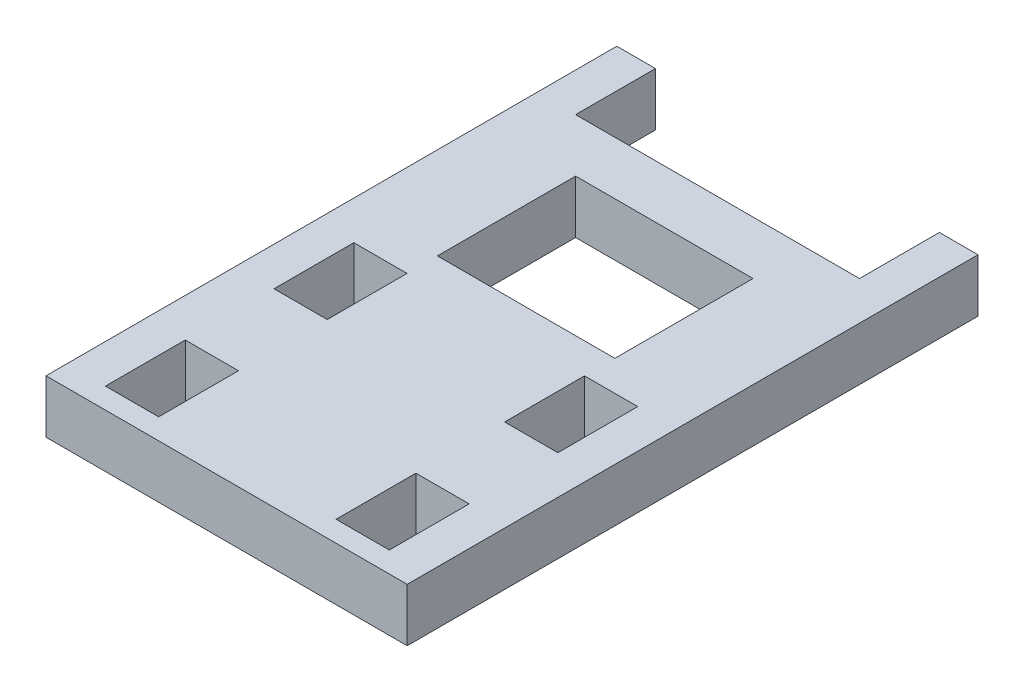
ISO-10303-21;
HEADER;
FILE_DESCRIPTION(('STEP AP214'),'2;1');
FILE_NAME('part.step','',(''),(''),'','','');
FILE_SCHEMA(('AUTOMOTIVE_DESIGN { 1 0 10303 214 1 1 1 1 }'));
ENDSEC;
DATA;
#1=APPLICATION_CONTEXT('core data for automotive mechanical design processes');
#2=APPLICATION_PROTOCOL_DEFINITION('international standard','automotive_design',2000,#1);
#3=PRODUCT_CONTEXT('',#1,'mechanical');
#4=PRODUCT('Part','Part','',(#3));
#5=PRODUCT_RELATED_PRODUCT_CATEGORY('part','',(#4));
#6=PRODUCT_DEFINITION_FORMATION('','',#4);
#7=PRODUCT_DEFINITION_CONTEXT('part definition',#1,'design');
#8=PRODUCT_DEFINITION('design','',#6,#7);
#9=PRODUCT_DEFINITION_SHAPE('','',#8);
#10=(LENGTH_UNIT() NAMED_UNIT(*) SI_UNIT(.MILLI.,.METRE.));
#11=(NAMED_UNIT(*) PLANE_ANGLE_UNIT() SI_UNIT($,.RADIAN.));
#12=(NAMED_UNIT(*) SI_UNIT($,.STERADIAN.) SOLID_ANGLE_UNIT());
#13=UNCERTAINTY_MEASURE_WITH_UNIT(LENGTH_MEASURE(1.E-05),#10,'distance_accuracy_value','');
#14=(GEOMETRIC_REPRESENTATION_CONTEXT(3) GLOBAL_UNCERTAINTY_ASSIGNED_CONTEXT((#13)) GLOBAL_UNIT_ASSIGNED_CONTEXT((#10,
#11,#12)) REPRESENTATION_CONTEXT('',''));
#15=CARTESIAN_POINT('',(0.,0.,0.));
#16=DIRECTION('',(0.,0.,1.));
#17=DIRECTION('',(1.,0.,0.));
#18=AXIS2_PLACEMENT_3D('',#15,#16,#17);
#19=CARTESIAN_POINT('',(0.,6.,0.));
#20=DIRECTION('',(0.,1.,0.));
#21=DIRECTION('',(0.,0.,1.));
#22=AXIS2_PLACEMENT_3D('',#19,#20,#21);
#23=PLANE('',#22);
#24=DIRECTION('',(1.,0.,0.));
#25=VECTOR('',#24,1.);
#26=CARTESIAN_POINT('',(-23.6219600534074,6.,14.5690045051622));
#27=LINE('',#26,#25);
#28=CARTESIAN_POINT('',(-23.6219600534074,6.,14.5690045051622));
#29=VERTEX_POINT('',#28);
#30=CARTESIAN_POINT('',(-17.6219600534074,6.,14.5690045051622));
#31=VERTEX_POINT('',#30);
#32=EDGE_CURVE('E265',#29,#31,#27,.T.);
#33=ORIENTED_EDGE('',*,*,#32,.F.);
#34=DIRECTION('',(0.,0.,1.));
#35=VECTOR('',#34,1.);
#36=CARTESIAN_POINT('',(-23.6219600534074,6.,5.56900450516224));
#37=LINE('',#36,#35);
#38=CARTESIAN_POINT('',(-23.6219600534074,6.,5.56900450516224));
#39=VERTEX_POINT('',#38);
#40=EDGE_CURVE('E263',#39,#29,#37,.T.);
#41=ORIENTED_EDGE('',*,*,#40,.F.);
#42=DIRECTION('',(-1.,0.,0.));
#43=VECTOR('',#42,1.);
#44=CARTESIAN_POINT('',(-23.6219600534074,6.,5.56900450516224));
#45=LINE('',#44,#43);
#46=CARTESIAN_POINT('',(-17.6219600534074,6.,5.56900450516224));
#47=VERTEX_POINT('',#46);
#48=EDGE_CURVE('E271',#47,#39,#45,.T.);
#49=ORIENTED_EDGE('',*,*,#48,.F.);
#50=DIRECTION('',(0.,0.,-1.));
#51=VECTOR('',#50,1.);
#52=CARTESIAN_POINT('',(-17.6219600534074,6.,5.56900450516224));
#53=LINE('',#52,#51);
#54=EDGE_CURVE('E268',#31,#47,#53,.T.);
#55=ORIENTED_EDGE('',*,*,#54,.F.);
#56=EDGE_LOOP('',(#33,#41,#49,#55));
#57=FACE_BOUND('',#56,.T.);
#58=DIRECTION('',(1.,0.,0.));
#59=VECTOR('',#58,1.);
#60=CARTESIAN_POINT('',(2.37803994659258,6.,14.5690045051622));
#61=LINE('',#60,#59);
#62=CARTESIAN_POINT('',(2.37803994659258,6.,14.5690045051622));
#63=VERTEX_POINT('',#62);
#64=CARTESIAN_POINT('',(8.37803994659258,6.,14.5690045051622));
#65=VERTEX_POINT('',#64);
#66=EDGE_CURVE('E327',#63,#65,#61,.T.);
#67=ORIENTED_EDGE('',*,*,#66,.F.);
#68=DIRECTION('',(0.,0.,1.));
#69=VECTOR('',#68,1.);
#70=CARTESIAN_POINT('',(2.37803994659258,6.,5.56900450516224));
#71=LINE('',#70,#69);
#72=CARTESIAN_POINT('',(2.37803994659258,6.,5.56900450516224));
#73=VERTEX_POINT('',#72);
#74=EDGE_CURVE('E325',#73,#63,#71,.T.);
#75=ORIENTED_EDGE('',*,*,#74,.F.);
#76=DIRECTION('',(-1.,0.,0.));
#77=VECTOR('',#76,1.);
#78=CARTESIAN_POINT('',(2.37803994659258,6.,5.56900450516224));
#79=LINE('',#78,#77);
#80=CARTESIAN_POINT('',(8.37803994659258,6.,5.56900450516224));
#81=VERTEX_POINT('',#80);
#82=EDGE_CURVE('E333',#81,#73,#79,.T.);
#83=ORIENTED_EDGE('',*,*,#82,.F.);
#84=DIRECTION('',(0.,0.,-1.));
#85=VECTOR('',#84,1.);
#86=CARTESIAN_POINT('',(8.37803994659258,6.,5.56900450516224));
#87=LINE('',#86,#85);
#88=EDGE_CURVE('E330',#65,#81,#87,.T.);
#89=ORIENTED_EDGE('',*,*,#88,.F.);
#90=EDGE_LOOP('',(#67,#75,#83,#89));
#91=FACE_BOUND('',#90,.T.);
#92=DIRECTION('',(0.,0.,-1.));
#93=VECTOR('',#92,1.);
#94=CARTESIAN_POINT('',(12.7338913134026,6.,-17.5799324330999));
#95=LINE('',#94,#93);
#96=CARTESIAN_POINT('',(12.7338913134026,6.,16.9099557832026));
#97=VERTEX_POINT('',#96);
#98=CARTESIAN_POINT('',(12.7338913134026,6.,-47.4309954948378));
#99=VERTEX_POINT('',#98);
#100=EDGE_CURVE('E387',#97,#99,#95,.T.);
#101=ORIENTED_EDGE('',*,*,#100,.T.);
#102=DIRECTION('',(-1.,0.,0.));
#103=VECTOR('',#102,1.);
#104=CARTESIAN_POINT('',(12.7338913134026,6.,-47.4309954948378));
#105=LINE('',#104,#103);
#106=CARTESIAN_POINT('',(8.37803994659257,6.,-47.4309954948378));
#107=VERTEX_POINT('',#106);
#108=EDGE_CURVE('E390',#99,#107,#105,.T.);
#109=ORIENTED_EDGE('',*,*,#108,.T.);
#110=DIRECTION('',(0.,0.,1.));
#111=VECTOR('',#110,1.);
#112=CARTESIAN_POINT('',(8.37803994659257,6.,-38.4309954948378));
#113=LINE('',#112,#111);
#114=CARTESIAN_POINT('',(8.37803994659257,6.,-38.4309954948378));
#115=VERTEX_POINT('',#114);
#116=EDGE_CURVE('E393',#107,#115,#113,.T.);
#117=ORIENTED_EDGE('',*,*,#116,.T.);
#118=DIRECTION('',(-1.,0.,0.));
#119=VECTOR('',#118,1.);
#120=CARTESIAN_POINT('',(-23.6219600534074,6.,-38.4309954948378));
#121=LINE('',#120,#119);
#122=CARTESIAN_POINT('',(-23.6219600534074,6.,-38.4309954948378));
#123=VERTEX_POINT('',#122);
#124=EDGE_CURVE('E395',#115,#123,#121,.T.);
#125=ORIENTED_EDGE('',*,*,#124,.T.);
#126=DIRECTION('',(0.,0.,-1.));
#127=VECTOR('',#126,1.);
#128=CARTESIAN_POINT('',(-23.6219600534074,6.,-38.4309954948378));
#129=LINE('',#128,#127);
#130=CARTESIAN_POINT('',(-23.6219600534074,6.,-47.4309954948378));
#131=VERTEX_POINT('',#130);
#132=EDGE_CURVE('E397',#123,#131,#129,.T.);
#133=ORIENTED_EDGE('',*,*,#132,.T.);
#134=DIRECTION('',(-1.,0.,0.));
#135=VECTOR('',#134,1.);
#136=CARTESIAN_POINT('',(-27.9778114202174,6.,-47.4309954948378));
#137=LINE('',#136,#135);
#138=CARTESIAN_POINT('',(-27.9778114202174,6.,-47.4309954948378));
#139=VERTEX_POINT('',#138);
#140=EDGE_CURVE('E399',#131,#139,#137,.T.);
#141=ORIENTED_EDGE('',*,*,#140,.T.);
#142=DIRECTION('',(0.,0.,1.));
#143=VECTOR('',#142,1.);
#144=CARTESIAN_POINT('',(-27.9778114202174,6.,-38.4309954948378));
#145=LINE('',#144,#143);
#146=CARTESIAN_POINT('',(-27.9778114202174,6.,16.9099557832026));
#147=VERTEX_POINT('',#146);
#148=EDGE_CURVE('E401',#139,#147,#145,.T.);
#149=ORIENTED_EDGE('',*,*,#148,.T.);
#150=DIRECTION('',(1.,0.,0.));
#151=VECTOR('',#150,1.);
#152=CARTESIAN_POINT('',(-27.9778114202174,6.,16.9099557832026));
#153=LINE('',#152,#151);
#154=EDGE_CURVE('E403',#147,#97,#153,.T.);
#155=ORIENTED_EDGE('',*,*,#154,.T.);
#156=EDGE_LOOP('',(#101,#109,#117,#125,#133,#141,#149,#155));
#157=FACE_BOUND('',#156,.T.);
#158=DIRECTION('',(1.,0.,0.));
#159=VECTOR('',#158,1.);
#160=CARTESIAN_POINT('',(2.37803994659258,6.,-4.43099549483776));
#161=LINE('',#160,#159);
#162=CARTESIAN_POINT('',(2.37803994659258,6.,-4.43099549483776));
#163=VERTEX_POINT('',#162);
#164=CARTESIAN_POINT('',(8.37803994659258,6.,-4.43099549483776));
#165=VERTEX_POINT('',#164);
#166=EDGE_CURVE('E358',#163,#165,#161,.T.);
#167=ORIENTED_EDGE('',*,*,#166,.F.);
#168=DIRECTION('',(0.,0.,1.));
#169=VECTOR('',#168,1.);
#170=CARTESIAN_POINT('',(2.37803994659258,6.,-13.4309954948378));
#171=LINE('',#170,#169);
#172=CARTESIAN_POINT('',(2.37803994659258,6.,-13.4309954948378));
#173=VERTEX_POINT('',#172);
#174=EDGE_CURVE('E356',#173,#163,#171,.T.);
#175=ORIENTED_EDGE('',*,*,#174,.F.);
#176=DIRECTION('',(-1.,0.,0.));
#177=VECTOR('',#176,1.);
#178=CARTESIAN_POINT('',(2.37803994659258,6.,-13.4309954948378));
#179=LINE('',#178,#177);
#180=CARTESIAN_POINT('',(8.37803994659257,6.,-13.4309954948378));
#181=VERTEX_POINT('',#180);
#182=EDGE_CURVE('E364',#181,#173,#179,.T.);
#183=ORIENTED_EDGE('',*,*,#182,.F.);
#184=DIRECTION('',(0.,0.,-1.));
#185=VECTOR('',#184,1.);
#186=CARTESIAN_POINT('',(8.37803994659257,6.,-13.4309954948378));
#187=LINE('',#186,#185);
#188=EDGE_CURVE('E361',#165,#181,#187,.T.);
#189=ORIENTED_EDGE('',*,*,#188,.F.);
#190=EDGE_LOOP('',(#167,#175,#183,#189));
#191=FACE_BOUND('',#190,.T.);
#192=DIRECTION('',(1.,0.,0.));
#193=VECTOR('',#192,1.);
#194=CARTESIAN_POINT('',(-23.6219600534074,6.,-4.43099549483776));
#195=LINE('',#194,#193);
#196=CARTESIAN_POINT('',(-23.6219600534074,6.,-4.43099549483776));
#197=VERTEX_POINT('',#196);
#198=CARTESIAN_POINT('',(-17.6219600534074,6.,-4.43099549483776));
#199=VERTEX_POINT('',#198);
#200=EDGE_CURVE('E296',#197,#199,#195,.T.);
#201=ORIENTED_EDGE('',*,*,#200,.F.);
#202=DIRECTION('',(0.,0.,1.));
#203=VECTOR('',#202,1.);
#204=CARTESIAN_POINT('',(-23.6219600534074,6.,-4.43099549483776));
#205=LINE('',#204,#203);
#206=CARTESIAN_POINT('',(-23.6219600534074,6.,-13.4309954948378));
#207=VERTEX_POINT('',#206);
#208=EDGE_CURVE('E294',#207,#197,#205,.T.);
#209=ORIENTED_EDGE('',*,*,#208,.F.);
#210=DIRECTION('',(-1.,0.,0.));
#211=VECTOR('',#210,1.);
#212=CARTESIAN_POINT('',(-23.6219600534074,6.,-13.4309954948378));
#213=LINE('',#212,#211);
#214=CARTESIAN_POINT('',(-17.6219600534074,6.,-13.4309954948378));
#215=VERTEX_POINT('',#214);
#216=EDGE_CURVE('E302',#215,#207,#213,.T.);
#217=ORIENTED_EDGE('',*,*,#216,.F.);
#218=DIRECTION('',(0.,0.,-1.));
#219=VECTOR('',#218,1.);
#220=CARTESIAN_POINT('',(-17.6219600534074,6.,-4.43099549483776));
#221=LINE('',#220,#219);
#222=EDGE_CURVE('E299',#199,#215,#221,.T.);
#223=ORIENTED_EDGE('',*,*,#222,.F.);
#224=EDGE_LOOP('',(#201,#209,#217,#223));
#225=FACE_BOUND('',#224,.T.);
#226=DIRECTION('',(1.,0.,0.));
#227=VECTOR('',#226,1.);
#228=CARTESIAN_POINT('',(-17.6219600534074,6.,-16.8517918825971));
#229=LINE('',#228,#227);
#230=CARTESIAN_POINT('',(-17.6219600534074,6.,-16.8517918825971));
#231=VERTEX_POINT('',#230);
#232=CARTESIAN_POINT('',(2.37803994659258,6.,-16.8517918825971));
#233=VERTEX_POINT('',#232);
#234=EDGE_CURVE('E231',#231,#233,#229,.T.);
#235=ORIENTED_EDGE('',*,*,#234,.F.);
#236=DIRECTION('',(0.,0.,1.));
#237=VECTOR('',#236,1.);
#238=CARTESIAN_POINT('',(-17.6219600534074,6.,-16.8517918825971));
#239=LINE('',#238,#237);
#240=CARTESIAN_POINT('',(-17.6219600534074,6.,-32.4309954948378));
#241=VERTEX_POINT('',#240);
#242=EDGE_CURVE('E223',#241,#231,#239,.T.);
#243=ORIENTED_EDGE('',*,*,#242,.F.);
#244=DIRECTION('',(-1.,0.,0.));
#245=VECTOR('',#244,1.);
#246=CARTESIAN_POINT('',(-17.6219600534074,6.,-32.4309954948378));
#247=LINE('',#246,#245);
#248=CARTESIAN_POINT('',(2.37803994659258,6.,-32.4309954948378));
#249=VERTEX_POINT('',#248);
#250=EDGE_CURVE('E246',#249,#241,#247,.T.);
#251=ORIENTED_EDGE('',*,*,#250,.F.);
#252=DIRECTION('',(0.,0.,-1.));
#253=VECTOR('',#252,1.);
#254=CARTESIAN_POINT('',(2.37803994659258,6.,-16.8517918825971));
#255=LINE('',#254,#253);
#256=EDGE_CURVE('E243',#233,#249,#255,.T.);
#257=ORIENTED_EDGE('',*,*,#256,.F.);
#258=EDGE_LOOP('',(#235,#243,#251,#257));
#259=FACE_BOUND('',#258,.T.);
#260=ADVANCED_FACE('F37',(#57,#91,#157,#191,#225,#259),#23,.T.);
#261=CARTESIAN_POINT('',(0.,0.,0.));
#262=DIRECTION('',(0.,1.,0.));
#263=DIRECTION('',(0.,0.,1.));
#264=AXIS2_PLACEMENT_3D('',#261,#262,#263);
#265=PLANE('',#264);
#266=DIRECTION('',(0.,0.,1.));
#267=VECTOR('',#266,1.);
#268=CARTESIAN_POINT('',(-23.6219600534074,0.,5.56900450516224));
#269=LINE('',#268,#267);
#270=CARTESIAN_POINT('',(-23.6219600534074,0.,5.56900450516224));
#271=VERTEX_POINT('',#270);
#272=CARTESIAN_POINT('',(-23.6219600534074,0.,14.5690045051622));
#273=VERTEX_POINT('',#272);
#274=EDGE_CURVE('E239',#271,#273,#269,.T.);
#275=ORIENTED_EDGE('',*,*,#274,.T.);
#276=DIRECTION('',(1.,0.,0.));
#277=VECTOR('',#276,1.);
#278=CARTESIAN_POINT('',(-23.6219600534074,0.,14.5690045051622));
#279=LINE('',#278,#277);
#280=CARTESIAN_POINT('',(-17.6219600534074,0.,14.5690045051622));
#281=VERTEX_POINT('',#280);
#282=EDGE_CURVE('E276',#273,#281,#279,.T.);
#283=ORIENTED_EDGE('',*,*,#282,.T.);
#284=DIRECTION('',(0.,0.,-1.));
#285=VECTOR('',#284,1.);
#286=CARTESIAN_POINT('',(-17.6219600534074,0.,5.56900450516224));
#287=LINE('',#286,#285);
#288=CARTESIAN_POINT('',(-17.6219600534074,0.,5.56900450516224));
#289=VERTEX_POINT('',#288);
#290=EDGE_CURVE('E279',#281,#289,#287,.T.);
#291=ORIENTED_EDGE('',*,*,#290,.T.);
#292=DIRECTION('',(-1.,0.,0.));
#293=VECTOR('',#292,1.);
#294=CARTESIAN_POINT('',(-23.6219600534074,0.,5.56900450516224));
#295=LINE('',#294,#293);
#296=EDGE_CURVE('E266',#289,#271,#295,.T.);
#297=ORIENTED_EDGE('',*,*,#296,.T.);
#298=EDGE_LOOP('',(#275,#283,#291,#297));
#299=FACE_BOUND('',#298,.T.);
#300=DIRECTION('',(0.,0.,1.));
#301=VECTOR('',#300,1.);
#302=CARTESIAN_POINT('',(2.37803994659258,0.,5.56900450516224));
#303=LINE('',#302,#301);
#304=CARTESIAN_POINT('',(2.37803994659258,0.,5.56900450516224));
#305=VERTEX_POINT('',#304);
#306=CARTESIAN_POINT('',(2.37803994659258,0.,14.5690045051622));
#307=VERTEX_POINT('',#306);
#308=EDGE_CURVE('E324',#305,#307,#303,.T.);
#309=ORIENTED_EDGE('',*,*,#308,.T.);
#310=DIRECTION('',(1.,0.,0.));
#311=VECTOR('',#310,1.);
#312=CARTESIAN_POINT('',(2.37803994659258,0.,14.5690045051622));
#313=LINE('',#312,#311);
#314=CARTESIAN_POINT('',(8.37803994659258,0.,14.5690045051622));
#315=VERTEX_POINT('',#314);
#316=EDGE_CURVE('E338',#307,#315,#313,.T.);
#317=ORIENTED_EDGE('',*,*,#316,.T.);
#318=DIRECTION('',(0.,0.,-1.));
#319=VECTOR('',#318,1.);
#320=CARTESIAN_POINT('',(8.37803994659258,0.,5.56900450516224));
#321=LINE('',#320,#319);
#322=CARTESIAN_POINT('',(8.37803994659258,0.,5.56900450516224));
#323=VERTEX_POINT('',#322);
#324=EDGE_CURVE('E341',#315,#323,#321,.T.);
#325=ORIENTED_EDGE('',*,*,#324,.T.);
#326=DIRECTION('',(-1.,0.,0.));
#327=VECTOR('',#326,1.);
#328=CARTESIAN_POINT('',(2.37803994659258,0.,5.56900450516224));
#329=LINE('',#328,#327);
#330=EDGE_CURVE('E328',#323,#305,#329,.T.);
#331=ORIENTED_EDGE('',*,*,#330,.T.);
#332=EDGE_LOOP('',(#309,#317,#325,#331));
#333=FACE_BOUND('',#332,.T.);
#334=DIRECTION('',(0.,0.,-1.));
#335=VECTOR('',#334,1.);
#336=CARTESIAN_POINT('',(12.7338913134026,0.,-38.4309954948378));
#337=LINE('',#336,#335);
#338=CARTESIAN_POINT('',(12.7338913134026,0.,16.9099557832026));
#339=VERTEX_POINT('',#338);
#340=CARTESIAN_POINT('',(12.7338913134026,0.,-47.4309954948378));
#341=VERTEX_POINT('',#340);
#342=EDGE_CURVE('E386',#339,#341,#337,.T.);
#343=ORIENTED_EDGE('',*,*,#342,.F.);
#344=DIRECTION('',(1.,0.,0.));
#345=VECTOR('',#344,1.);
#346=CARTESIAN_POINT('',(-27.9778114202174,0.,16.9099557832026));
#347=LINE('',#346,#345);
#348=CARTESIAN_POINT('',(-27.9778114202174,0.,16.9099557832026));
#349=VERTEX_POINT('',#348);
#350=EDGE_CURVE('E391',#349,#339,#347,.T.);
#351=ORIENTED_EDGE('',*,*,#350,.F.);
#352=DIRECTION('',(0.,0.,1.));
#353=VECTOR('',#352,1.);
#354=CARTESIAN_POINT('',(-27.9778114202174,0.,-17.5799324330999));
#355=LINE('',#354,#353);
#356=CARTESIAN_POINT('',(-27.9778114202174,0.,-47.4309954948378));
#357=VERTEX_POINT('',#356);
#358=EDGE_CURVE('E418',#357,#349,#355,.T.);
#359=ORIENTED_EDGE('',*,*,#358,.F.);
#360=DIRECTION('',(-1.,0.,0.));
#361=VECTOR('',#360,1.);
#362=CARTESIAN_POINT('',(-27.9778114202174,0.,-47.4309954948378));
#363=LINE('',#362,#361);
#364=CARTESIAN_POINT('',(-23.6219600534074,0.,-47.4309954948378));
#365=VERTEX_POINT('',#364);
#366=EDGE_CURVE('E415',#365,#357,#363,.T.);
#367=ORIENTED_EDGE('',*,*,#366,.F.);
#368=DIRECTION('',(0.,0.,-1.));
#369=VECTOR('',#368,1.);
#370=CARTESIAN_POINT('',(-23.6219600534074,0.,-38.4309954948378));
#371=LINE('',#370,#369);
#372=CARTESIAN_POINT('',(-23.6219600534074,0.,-38.4309954948378));
#373=VERTEX_POINT('',#372);
#374=EDGE_CURVE('E413',#373,#365,#371,.T.);
#375=ORIENTED_EDGE('',*,*,#374,.F.);
#376=DIRECTION('',(-1.,0.,0.));
#377=VECTOR('',#376,1.);
#378=CARTESIAN_POINT('',(-23.6219600534074,0.,-38.4309954948378));
#379=LINE('',#378,#377);
#380=CARTESIAN_POINT('',(8.37803994659257,0.,-38.4309954948378));
#381=VERTEX_POINT('',#380);
#382=EDGE_CURVE('E411',#381,#373,#379,.T.);
#383=ORIENTED_EDGE('',*,*,#382,.F.);
#384=DIRECTION('',(0.,0.,1.));
#385=VECTOR('',#384,1.);
#386=CARTESIAN_POINT('',(8.37803994659257,0.,-38.4309954948378));
#387=LINE('',#386,#385);
#388=CARTESIAN_POINT('',(8.37803994659257,0.,-47.4309954948378));
#389=VERTEX_POINT('',#388);
#390=EDGE_CURVE('E409',#389,#381,#387,.T.);
#391=ORIENTED_EDGE('',*,*,#390,.F.);
#392=DIRECTION('',(-1.,0.,0.));
#393=VECTOR('',#392,1.);
#394=CARTESIAN_POINT('',(12.7338913134026,0.,-47.4309954948378));
#395=LINE('',#394,#393);
#396=EDGE_CURVE('E407',#341,#389,#395,.T.);
#397=ORIENTED_EDGE('',*,*,#396,.F.);
#398=EDGE_LOOP('',(#343,#351,#359,#367,#375,#383,#391,#397));
#399=FACE_BOUND('',#398,.T.);
#400=DIRECTION('',(0.,0.,1.));
#401=VECTOR('',#400,1.);
#402=CARTESIAN_POINT('',(2.37803994659258,0.,-13.4309954948378));
#403=LINE('',#402,#401);
#404=CARTESIAN_POINT('',(2.37803994659258,0.,-13.4309954948378));
#405=VERTEX_POINT('',#404);
#406=CARTESIAN_POINT('',(2.37803994659258,0.,-4.43099549483776));
#407=VERTEX_POINT('',#406);
#408=EDGE_CURVE('E355',#405,#407,#403,.T.);
#409=ORIENTED_EDGE('',*,*,#408,.T.);
#410=DIRECTION('',(1.,0.,0.));
#411=VECTOR('',#410,1.);
#412=CARTESIAN_POINT('',(2.37803994659258,0.,-4.43099549483776));
#413=LINE('',#412,#411);
#414=CARTESIAN_POINT('',(8.37803994659258,0.,-4.43099549483776));
#415=VERTEX_POINT('',#414);
#416=EDGE_CURVE('E369',#407,#415,#413,.T.);
#417=ORIENTED_EDGE('',*,*,#416,.T.);
#418=DIRECTION('',(0.,0.,-1.));
#419=VECTOR('',#418,1.);
#420=CARTESIAN_POINT('',(8.37803994659257,0.,-13.4309954948378));
#421=LINE('',#420,#419);
#422=CARTESIAN_POINT('',(8.37803994659257,0.,-13.4309954948378));
#423=VERTEX_POINT('',#422);
#424=EDGE_CURVE('E372',#415,#423,#421,.T.);
#425=ORIENTED_EDGE('',*,*,#424,.T.);
#426=DIRECTION('',(-1.,0.,0.));
#427=VECTOR('',#426,1.);
#428=CARTESIAN_POINT('',(2.37803994659258,0.,-13.4309954948378));
#429=LINE('',#428,#427);
#430=EDGE_CURVE('E359',#423,#405,#429,.T.);
#431=ORIENTED_EDGE('',*,*,#430,.T.);
#432=EDGE_LOOP('',(#409,#417,#425,#431));
#433=FACE_BOUND('',#432,.T.);
#434=DIRECTION('',(0.,0.,1.));
#435=VECTOR('',#434,1.);
#436=CARTESIAN_POINT('',(-23.6219600534074,0.,-4.43099549483776));
#437=LINE('',#436,#435);
#438=CARTESIAN_POINT('',(-23.6219600534074,0.,-13.4309954948378));
#439=VERTEX_POINT('',#438);
#440=CARTESIAN_POINT('',(-23.6219600534074,0.,-4.43099549483776));
#441=VERTEX_POINT('',#440);
#442=EDGE_CURVE('E293',#439,#441,#437,.T.);
#443=ORIENTED_EDGE('',*,*,#442,.T.);
#444=DIRECTION('',(1.,0.,0.));
#445=VECTOR('',#444,1.);
#446=CARTESIAN_POINT('',(-23.6219600534074,0.,-4.43099549483776));
#447=LINE('',#446,#445);
#448=CARTESIAN_POINT('',(-17.6219600534074,0.,-4.43099549483776));
#449=VERTEX_POINT('',#448);
#450=EDGE_CURVE('E307',#441,#449,#447,.T.);
#451=ORIENTED_EDGE('',*,*,#450,.T.);
#452=DIRECTION('',(0.,0.,-1.));
#453=VECTOR('',#452,1.);
#454=CARTESIAN_POINT('',(-17.6219600534074,0.,-4.43099549483776));
#455=LINE('',#454,#453);
#456=CARTESIAN_POINT('',(-17.6219600534074,0.,-13.4309954948378));
#457=VERTEX_POINT('',#456);
#458=EDGE_CURVE('E310',#449,#457,#455,.T.);
#459=ORIENTED_EDGE('',*,*,#458,.T.);
#460=DIRECTION('',(-1.,0.,0.));
#461=VECTOR('',#460,1.);
#462=CARTESIAN_POINT('',(-23.6219600534074,0.,-13.4309954948378));
#463=LINE('',#462,#461);
#464=EDGE_CURVE('E297',#457,#439,#463,.T.);
#465=ORIENTED_EDGE('',*,*,#464,.T.);
#466=EDGE_LOOP('',(#443,#451,#459,#465));
#467=FACE_BOUND('',#466,.T.);
#468=DIRECTION('',(0.,0.,1.));
#469=VECTOR('',#468,1.);
#470=CARTESIAN_POINT('',(-17.6219600534074,0.,-16.8517918825971));
#471=LINE('',#470,#469);
#472=CARTESIAN_POINT('',(-17.6219600534074,0.,-32.4309954948378));
#473=VERTEX_POINT('',#472);
#474=CARTESIAN_POINT('',(-17.6219600534074,0.,-16.8517918825971));
#475=VERTEX_POINT('',#474);
#476=EDGE_CURVE('E60',#473,#475,#471,.T.);
#477=ORIENTED_EDGE('',*,*,#476,.T.);
#478=DIRECTION('',(1.,0.,0.));
#479=VECTOR('',#478,1.);
#480=CARTESIAN_POINT('',(-17.6219600534074,0.,-16.8517918825971));
#481=LINE('',#480,#479);
#482=CARTESIAN_POINT('',(2.37803994659258,0.,-16.8517918825971));
#483=VERTEX_POINT('',#482);
#484=EDGE_CURVE('E238',#475,#483,#481,.T.);
#485=ORIENTED_EDGE('',*,*,#484,.T.);
#486=DIRECTION('',(0.,0.,-1.));
#487=VECTOR('',#486,1.);
#488=CARTESIAN_POINT('',(2.37803994659258,0.,-16.8517918825971));
#489=LINE('',#488,#487);
#490=CARTESIAN_POINT('',(2.37803994659258,0.,-32.4309954948378));
#491=VERTEX_POINT('',#490);
#492=EDGE_CURVE('E252',#483,#491,#489,.T.);
#493=ORIENTED_EDGE('',*,*,#492,.T.);
#494=DIRECTION('',(-1.,0.,0.));
#495=VECTOR('',#494,1.);
#496=CARTESIAN_POINT('',(-17.6219600534074,0.,-32.4309954948378));
#497=LINE('',#496,#495);
#498=EDGE_CURVE('E232',#491,#473,#497,.T.);
#499=ORIENTED_EDGE('',*,*,#498,.T.);
#500=EDGE_LOOP('',(#477,#485,#493,#499));
#501=FACE_BOUND('',#500,.T.);
#502=ADVANCED_FACE('F450',(#299,#333,#399,#433,#467,#501),#265,.F.);
#503=CARTESIAN_POINT('',(12.7338913134026,6.,-38.4309954948378));
#504=DIRECTION('',(-1.,0.,0.));
#505=DIRECTION('',(0.,0.,1.));
#506=AXIS2_PLACEMENT_3D('',#503,#504,#505);
#507=PLANE('',#506);
#508=ORIENTED_EDGE('',*,*,#342,.T.);
#509=DIRECTION('',(0.,-1.,0.));
#510=VECTOR('',#509,1.);
#511=CARTESIAN_POINT('',(12.7338913134026,6.,-47.4309954948378));
#512=LINE('',#511,#510);
#513=EDGE_CURVE('E11',#99,#341,#512,.T.);
#514=ORIENTED_EDGE('',*,*,#513,.F.);
#515=ORIENTED_EDGE('',*,*,#100,.F.);
#516=DIRECTION('',(0.,-1.,0.));
#517=VECTOR('',#516,1.);
#518=CARTESIAN_POINT('',(12.7338913134026,6.,16.9099557832026));
#519=LINE('',#518,#517);
#520=EDGE_CURVE('E405',#97,#339,#519,.T.);
#521=ORIENTED_EDGE('',*,*,#520,.T.);
#522=EDGE_LOOP('',(#508,#514,#515,#521));
#523=FACE_BOUND('',#522,.T.);
#524=ADVANCED_FACE('F39',(#523),#507,.F.);
#525=CARTESIAN_POINT('',(12.7338913134026,6.,-47.4309954948378));
#526=DIRECTION('',(0.,0.,1.));
#527=DIRECTION('',(1.,0.,0.));
#528=AXIS2_PLACEMENT_3D('',#525,#526,#527);
#529=PLANE('',#528);
#530=ORIENTED_EDGE('',*,*,#396,.T.);
#531=DIRECTION('',(0.,-1.,0.));
#532=VECTOR('',#531,1.);
#533=CARTESIAN_POINT('',(8.37803994659257,6.,-47.4309954948378));
#534=LINE('',#533,#532);
#535=EDGE_CURVE('E45',#107,#389,#534,.T.);
#536=ORIENTED_EDGE('',*,*,#535,.F.);
#537=ORIENTED_EDGE('',*,*,#108,.F.);
#538=ORIENTED_EDGE('',*,*,#513,.T.);
#539=EDGE_LOOP('',(#530,#536,#537,#538));
#540=FACE_BOUND('',#539,.T.);
#541=ADVANCED_FACE('F468',(#540),#529,.F.);
#542=CARTESIAN_POINT('',(8.37803994659257,6.,-38.4309954948378));
#543=DIRECTION('',(1.,0.,0.));
#544=DIRECTION('',(0.,0.,-1.));
#545=AXIS2_PLACEMENT_3D('',#542,#543,#544);
#546=PLANE('',#545);
#547=ORIENTED_EDGE('',*,*,#390,.T.);
#548=DIRECTION('',(0.,-1.,0.));
#549=VECTOR('',#548,1.);
#550=CARTESIAN_POINT('',(8.37803994659257,6.,-38.4309954948378));
#551=LINE('',#550,#549);
#552=EDGE_CURVE('E436',#115,#381,#551,.T.);
#553=ORIENTED_EDGE('',*,*,#552,.F.);
#554=ORIENTED_EDGE('',*,*,#116,.F.);
#555=ORIENTED_EDGE('',*,*,#535,.T.);
#556=EDGE_LOOP('',(#547,#553,#554,#555));
#557=FACE_BOUND('',#556,.T.);
#558=ADVANCED_FACE('F443',(#557),#546,.F.);
#559=CARTESIAN_POINT('',(-23.6219600534074,6.,-38.4309954948378));
#560=DIRECTION('',(0.,0.,1.));
#561=DIRECTION('',(1.,0.,0.));
#562=AXIS2_PLACEMENT_3D('',#559,#560,#561);
#563=PLANE('',#562);
#564=ORIENTED_EDGE('',*,*,#382,.T.);
#565=DIRECTION('',(0.,-1.,0.));
#566=VECTOR('',#565,1.);
#567=CARTESIAN_POINT('',(-23.6219600534074,6.,-38.4309954948378));
#568=LINE('',#567,#566);
#569=EDGE_CURVE('E433',#123,#373,#568,.T.);
#570=ORIENTED_EDGE('',*,*,#569,.F.);
#571=ORIENTED_EDGE('',*,*,#124,.F.);
#572=ORIENTED_EDGE('',*,*,#552,.T.);
#573=EDGE_LOOP('',(#564,#570,#571,#572));
#574=FACE_BOUND('',#573,.T.);
#575=ADVANCED_FACE('F456',(#574),#563,.F.);
#576=CARTESIAN_POINT('',(-23.6219600534074,6.,-38.4309954948378));
#577=DIRECTION('',(-1.,0.,0.));
#578=DIRECTION('',(0.,0.,1.));
#579=AXIS2_PLACEMENT_3D('',#576,#577,#578);
#580=PLANE('',#579);
#581=ORIENTED_EDGE('',*,*,#374,.T.);
#582=DIRECTION('',(0.,-1.,0.));
#583=VECTOR('',#582,1.);
#584=CARTESIAN_POINT('',(-23.6219600534074,6.,-47.4309954948378));
#585=LINE('',#584,#583);
#586=EDGE_CURVE('E430',#131,#365,#585,.T.);
#587=ORIENTED_EDGE('',*,*,#586,.F.);
#588=ORIENTED_EDGE('',*,*,#132,.F.);
#589=ORIENTED_EDGE('',*,*,#569,.T.);
#590=EDGE_LOOP('',(#581,#587,#588,#589));
#591=FACE_BOUND('',#590,.T.);
#592=ADVANCED_FACE('F460',(#591),#580,.F.);
#593=CARTESIAN_POINT('',(-27.9778114202174,6.,-47.4309954948378));
#594=DIRECTION('',(0.,0.,1.));
#595=DIRECTION('',(1.,0.,0.));
#596=AXIS2_PLACEMENT_3D('',#593,#594,#595);
#597=PLANE('',#596);
#598=ORIENTED_EDGE('',*,*,#366,.T.);
#599=DIRECTION('',(0.,-1.,0.));
#600=VECTOR('',#599,1.);
#601=CARTESIAN_POINT('',(-27.9778114202174,6.,-47.4309954948378));
#602=LINE('',#601,#600);
#603=EDGE_CURVE('E427',#139,#357,#602,.T.);
#604=ORIENTED_EDGE('',*,*,#603,.F.);
#605=ORIENTED_EDGE('',*,*,#140,.F.);
#606=ORIENTED_EDGE('',*,*,#586,.T.);
#607=EDGE_LOOP('',(#598,#604,#605,#606));
#608=FACE_BOUND('',#607,.T.);
#609=ADVANCED_FACE('F480',(#608),#597,.F.);
#610=CARTESIAN_POINT('',(-27.9778114202174,6.,-17.5799324330999));
#611=DIRECTION('',(1.,0.,0.));
#612=DIRECTION('',(0.,0.,-1.));
#613=AXIS2_PLACEMENT_3D('',#610,#611,#612);
#614=PLANE('',#613);
#615=ORIENTED_EDGE('',*,*,#358,.T.);
#616=DIRECTION('',(0.,-1.,0.));
#617=VECTOR('',#616,1.);
#618=CARTESIAN_POINT('',(-27.9778114202174,6.,16.9099557832026));
#619=LINE('',#618,#617);
#620=EDGE_CURVE('E424',#147,#349,#619,.T.);
#621=ORIENTED_EDGE('',*,*,#620,.F.);
#622=ORIENTED_EDGE('',*,*,#148,.F.);
#623=ORIENTED_EDGE('',*,*,#603,.T.);
#624=EDGE_LOOP('',(#615,#621,#622,#623));
#625=FACE_BOUND('',#624,.T.);
#626=ADVANCED_FACE('F478',(#625),#614,.F.);
#627=CARTESIAN_POINT('',(-27.9778114202174,6.,16.9099557832026));
#628=DIRECTION('',(0.,0.,-1.));
#629=DIRECTION('',(-1.,0.,0.));
#630=AXIS2_PLACEMENT_3D('',#627,#628,#629);
#631=PLANE('',#630);
#632=ORIENTED_EDGE('',*,*,#350,.T.);
#633=ORIENTED_EDGE('',*,*,#520,.F.);
#634=ORIENTED_EDGE('',*,*,#154,.F.);
#635=ORIENTED_EDGE('',*,*,#620,.T.);
#636=EDGE_LOOP('',(#632,#633,#634,#635));
#637=FACE_BOUND('',#636,.T.);
#638=ADVANCED_FACE('F473',(#637),#631,.F.);
#639=CARTESIAN_POINT('',(2.37803994659258,6.,-13.4309954948378));
#640=DIRECTION('',(1.,0.,0.));
#641=DIRECTION('',(0.,0.,-1.));
#642=AXIS2_PLACEMENT_3D('',#639,#640,#641);
#643=PLANE('',#642);
#644=ORIENTED_EDGE('',*,*,#408,.F.);
#645=DIRECTION('',(0.,-1.,0.));
#646=VECTOR('',#645,1.);
#647=CARTESIAN_POINT('',(2.37803994659258,6.,-13.4309954948378));
#648=LINE('',#647,#646);
#649=EDGE_CURVE('E366',#173,#405,#648,.T.);
#650=ORIENTED_EDGE('',*,*,#649,.F.);
#651=ORIENTED_EDGE('',*,*,#174,.T.);
#652=DIRECTION('',(0.,-1.,0.));
#653=VECTOR('',#652,1.);
#654=CARTESIAN_POINT('',(2.37803994659258,6.,-4.43099549483776));
#655=LINE('',#654,#653);
#656=EDGE_CURVE('E383',#163,#407,#655,.T.);
#657=ORIENTED_EDGE('',*,*,#656,.T.);
#658=EDGE_LOOP('',(#644,#650,#651,#657));
#659=FACE_BOUND('',#658,.T.);
#660=ADVANCED_FACE('F500',(#659),#643,.T.);
#661=CARTESIAN_POINT('',(2.37803994659258,6.,-4.43099549483776));
#662=DIRECTION('',(0.,0.,-1.));
#663=DIRECTION('',(-1.,0.,0.));
#664=AXIS2_PLACEMENT_3D('',#661,#662,#663);
#665=PLANE('',#664);
#666=ORIENTED_EDGE('',*,*,#416,.F.);
#667=ORIENTED_EDGE('',*,*,#656,.F.);
#668=ORIENTED_EDGE('',*,*,#166,.T.);
#669=DIRECTION('',(0.,-1.,0.));
#670=VECTOR('',#669,1.);
#671=CARTESIAN_POINT('',(8.37803994659258,6.,-4.43099549483776));
#672=LINE('',#671,#670);
#673=EDGE_CURVE('E381',#165,#415,#672,.T.);
#674=ORIENTED_EDGE('',*,*,#673,.T.);
#675=EDGE_LOOP('',(#666,#667,#668,#674));
#676=FACE_BOUND('',#675,.T.);
#677=ADVANCED_FACE('F507',(#676),#665,.T.);
#678=CARTESIAN_POINT('',(8.37803994659257,6.,-13.4309954948378));
#679=DIRECTION('',(-1.,0.,0.));
#680=DIRECTION('',(0.,0.,1.));
#681=AXIS2_PLACEMENT_3D('',#678,#679,#680);
#682=PLANE('',#681);
#683=ORIENTED_EDGE('',*,*,#424,.F.);
#684=ORIENTED_EDGE('',*,*,#673,.F.);
#685=ORIENTED_EDGE('',*,*,#188,.T.);
#686=DIRECTION('',(0.,-1.,0.));
#687=VECTOR('',#686,1.);
#688=CARTESIAN_POINT('',(8.37803994659257,6.,-13.4309954948378));
#689=LINE('',#688,#687);
#690=EDGE_CURVE('E379',#181,#423,#689,.T.);
#691=ORIENTED_EDGE('',*,*,#690,.T.);
#692=EDGE_LOOP('',(#683,#684,#685,#691));
#693=FACE_BOUND('',#692,.T.);
#694=ADVANCED_FACE('F512',(#693),#682,.T.);
#695=CARTESIAN_POINT('',(2.37803994659258,6.,-13.4309954948378));
#696=DIRECTION('',(0.,0.,1.));
#697=DIRECTION('',(1.,0.,0.));
#698=AXIS2_PLACEMENT_3D('',#695,#696,#697);
#699=PLANE('',#698);
#700=ORIENTED_EDGE('',*,*,#430,.F.);
#701=ORIENTED_EDGE('',*,*,#690,.F.);
#702=ORIENTED_EDGE('',*,*,#182,.T.);
#703=ORIENTED_EDGE('',*,*,#649,.T.);
#704=EDGE_LOOP('',(#700,#701,#702,#703));
#705=FACE_BOUND('',#704,.T.);
#706=ADVANCED_FACE('F519',(#705),#699,.T.);
#707=CARTESIAN_POINT('',(2.37803994659258,6.,5.56900450516224));
#708=DIRECTION('',(1.,0.,0.));
#709=DIRECTION('',(0.,0.,-1.));
#710=AXIS2_PLACEMENT_3D('',#707,#708,#709);
#711=PLANE('',#710);
#712=ORIENTED_EDGE('',*,*,#308,.F.);
#713=DIRECTION('',(0.,-1.,0.));
#714=VECTOR('',#713,1.);
#715=CARTESIAN_POINT('',(2.37803994659258,6.,5.56900450516224));
#716=LINE('',#715,#714);
#717=EDGE_CURVE('E335',#73,#305,#716,.T.);
#718=ORIENTED_EDGE('',*,*,#717,.F.);
#719=ORIENTED_EDGE('',*,*,#74,.T.);
#720=DIRECTION('',(0.,-1.,0.));
#721=VECTOR('',#720,1.);
#722=CARTESIAN_POINT('',(2.37803994659258,6.,14.5690045051622));
#723=LINE('',#722,#721);
#724=EDGE_CURVE('E352',#63,#307,#723,.T.);
#725=ORIENTED_EDGE('',*,*,#724,.T.);
#726=EDGE_LOOP('',(#712,#718,#719,#725));
#727=FACE_BOUND('',#726,.T.);
#728=ADVANCED_FACE('F574',(#727),#711,.T.);
#729=CARTESIAN_POINT('',(2.37803994659258,6.,14.5690045051622));
#730=DIRECTION('',(0.,0.,-1.));
#731=DIRECTION('',(-1.,0.,0.));
#732=AXIS2_PLACEMENT_3D('',#729,#730,#731);
#733=PLANE('',#732);
#734=ORIENTED_EDGE('',*,*,#316,.F.);
#735=ORIENTED_EDGE('',*,*,#724,.F.);
#736=ORIENTED_EDGE('',*,*,#66,.T.);
#737=DIRECTION('',(0.,-1.,0.));
#738=VECTOR('',#737,1.);
#739=CARTESIAN_POINT('',(8.37803994659258,6.,14.5690045051622));
#740=LINE('',#739,#738);
#741=EDGE_CURVE('E350',#65,#315,#740,.T.);
#742=ORIENTED_EDGE('',*,*,#741,.T.);
#743=EDGE_LOOP('',(#734,#735,#736,#742));
#744=FACE_BOUND('',#743,.T.);
#745=ADVANCED_FACE('F570',(#744),#733,.T.);
#746=CARTESIAN_POINT('',(8.37803994659258,6.,5.56900450516224));
#747=DIRECTION('',(-1.,0.,0.));
#748=DIRECTION('',(0.,0.,1.));
#749=AXIS2_PLACEMENT_3D('',#746,#747,#748);
#750=PLANE('',#749);
#751=ORIENTED_EDGE('',*,*,#324,.F.);
#752=ORIENTED_EDGE('',*,*,#741,.F.);
#753=ORIENTED_EDGE('',*,*,#88,.T.);
#754=DIRECTION('',(0.,-1.,0.));
#755=VECTOR('',#754,1.);
#756=CARTESIAN_POINT('',(8.37803994659258,6.,5.56900450516224));
#757=LINE('',#756,#755);
#758=EDGE_CURVE('E348',#81,#323,#757,.T.);
#759=ORIENTED_EDGE('',*,*,#758,.T.);
#760=EDGE_LOOP('',(#751,#752,#753,#759));
#761=FACE_BOUND('',#760,.T.);
#762=ADVANCED_FACE('F566',(#761),#750,.T.);
#763=CARTESIAN_POINT('',(2.37803994659258,6.,5.56900450516224));
#764=DIRECTION('',(0.,0.,1.));
#765=DIRECTION('',(1.,0.,0.));
#766=AXIS2_PLACEMENT_3D('',#763,#764,#765);
#767=PLANE('',#766);
#768=ORIENTED_EDGE('',*,*,#330,.F.);
#769=ORIENTED_EDGE('',*,*,#758,.F.);
#770=ORIENTED_EDGE('',*,*,#82,.T.);
#771=ORIENTED_EDGE('',*,*,#717,.T.);
#772=EDGE_LOOP('',(#768,#769,#770,#771));
#773=FACE_BOUND('',#772,.T.);
#774=ADVANCED_FACE('F563',(#773),#767,.T.);
#775=CARTESIAN_POINT('',(-23.6219600534074,6.,-4.43099549483776));
#776=DIRECTION('',(1.,0.,0.));
#777=DIRECTION('',(0.,0.,-1.));
#778=AXIS2_PLACEMENT_3D('',#775,#776,#777);
#779=PLANE('',#778);
#780=ORIENTED_EDGE('',*,*,#442,.F.);
#781=DIRECTION('',(0.,-1.,0.));
#782=VECTOR('',#781,1.);
#783=CARTESIAN_POINT('',(-23.6219600534074,6.,-13.4309954948378));
#784=LINE('',#783,#782);
#785=EDGE_CURVE('E304',#207,#439,#784,.T.);
#786=ORIENTED_EDGE('',*,*,#785,.F.);
#787=ORIENTED_EDGE('',*,*,#208,.T.);
#788=DIRECTION('',(0.,-1.,0.));
#789=VECTOR('',#788,1.);
#790=CARTESIAN_POINT('',(-23.6219600534074,6.,-4.43099549483776));
#791=LINE('',#790,#789);
#792=EDGE_CURVE('E321',#197,#441,#791,.T.);
#793=ORIENTED_EDGE('',*,*,#792,.T.);
#794=EDGE_LOOP('',(#780,#786,#787,#793));
#795=FACE_BOUND('',#794,.T.);
#796=ADVANCED_FACE('F542',(#795),#779,.T.);
#797=CARTESIAN_POINT('',(-23.6219600534074,6.,-4.43099549483776));
#798=DIRECTION('',(0.,0.,-1.));
#799=DIRECTION('',(-1.,0.,0.));
#800=AXIS2_PLACEMENT_3D('',#797,#798,#799);
#801=PLANE('',#800);
#802=ORIENTED_EDGE('',*,*,#450,.F.);
#803=ORIENTED_EDGE('',*,*,#792,.F.);
#804=ORIENTED_EDGE('',*,*,#200,.T.);
#805=DIRECTION('',(0.,-1.,0.));
#806=VECTOR('',#805,1.);
#807=CARTESIAN_POINT('',(-17.6219600534074,6.,-4.43099549483776));
#808=LINE('',#807,#806);
#809=EDGE_CURVE('E319',#199,#449,#808,.T.);
#810=ORIENTED_EDGE('',*,*,#809,.T.);
#811=EDGE_LOOP('',(#802,#803,#804,#810));
#812=FACE_BOUND('',#811,.T.);
#813=ADVANCED_FACE('F535',(#812),#801,.T.);
#814=CARTESIAN_POINT('',(-17.6219600534074,6.,-4.43099549483776));
#815=DIRECTION('',(-1.,0.,0.));
#816=DIRECTION('',(0.,0.,1.));
#817=AXIS2_PLACEMENT_3D('',#814,#815,#816);
#818=PLANE('',#817);
#819=ORIENTED_EDGE('',*,*,#458,.F.);
#820=ORIENTED_EDGE('',*,*,#809,.F.);
#821=ORIENTED_EDGE('',*,*,#222,.T.);
#822=DIRECTION('',(0.,-1.,0.));
#823=VECTOR('',#822,1.);
#824=CARTESIAN_POINT('',(-17.6219600534074,6.,-13.4309954948378));
#825=LINE('',#824,#823);
#826=EDGE_CURVE('E317',#215,#457,#825,.T.);
#827=ORIENTED_EDGE('',*,*,#826,.T.);
#828=EDGE_LOOP('',(#819,#820,#821,#827));
#829=FACE_BOUND('',#828,.T.);
#830=ADVANCED_FACE('F538',(#829),#818,.T.);
#831=CARTESIAN_POINT('',(-23.6219600534074,6.,-13.4309954948378));
#832=DIRECTION('',(0.,0.,1.));
#833=DIRECTION('',(1.,0.,0.));
#834=AXIS2_PLACEMENT_3D('',#831,#832,#833);
#835=PLANE('',#834);
#836=ORIENTED_EDGE('',*,*,#464,.F.);
#837=ORIENTED_EDGE('',*,*,#826,.F.);
#838=ORIENTED_EDGE('',*,*,#216,.T.);
#839=ORIENTED_EDGE('',*,*,#785,.T.);
#840=EDGE_LOOP('',(#836,#837,#838,#839));
#841=FACE_BOUND('',#840,.T.);
#842=ADVANCED_FACE('F545',(#841),#835,.T.);
#843=CARTESIAN_POINT('',(-23.6219600534074,6.,5.56900450516224));
#844=DIRECTION('',(1.,0.,0.));
#845=DIRECTION('',(0.,0.,-1.));
#846=AXIS2_PLACEMENT_3D('',#843,#844,#845);
#847=PLANE('',#846);
#848=ORIENTED_EDGE('',*,*,#274,.F.);
#849=DIRECTION('',(0.,-1.,0.));
#850=VECTOR('',#849,1.);
#851=CARTESIAN_POINT('',(-23.6219600534074,6.,5.56900450516224));
#852=LINE('',#851,#850);
#853=EDGE_CURVE('E273',#39,#271,#852,.T.);
#854=ORIENTED_EDGE('',*,*,#853,.F.);
#855=ORIENTED_EDGE('',*,*,#40,.T.);
#856=DIRECTION('',(0.,-1.,0.));
#857=VECTOR('',#856,1.);
#858=CARTESIAN_POINT('',(-23.6219600534074,6.,14.5690045051622));
#859=LINE('',#858,#857);
#860=EDGE_CURVE('E290',#29,#273,#859,.T.);
#861=ORIENTED_EDGE('',*,*,#860,.T.);
#862=EDGE_LOOP('',(#848,#854,#855,#861));
#863=FACE_BOUND('',#862,.T.);
#864=ADVANCED_FACE('F547',(#863),#847,.T.);
#865=CARTESIAN_POINT('',(-23.6219600534074,6.,14.5690045051622));
#866=DIRECTION('',(0.,0.,-1.));
#867=DIRECTION('',(-1.,0.,0.));
#868=AXIS2_PLACEMENT_3D('',#865,#866,#867);
#869=PLANE('',#868);
#870=ORIENTED_EDGE('',*,*,#282,.F.);
#871=ORIENTED_EDGE('',*,*,#860,.F.);
#872=ORIENTED_EDGE('',*,*,#32,.T.);
#873=DIRECTION('',(0.,-1.,0.));
#874=VECTOR('',#873,1.);
#875=CARTESIAN_POINT('',(-17.6219600534074,6.,14.5690045051622));
#876=LINE('',#875,#874);
#877=EDGE_CURVE('E288',#31,#281,#876,.T.);
#878=ORIENTED_EDGE('',*,*,#877,.T.);
#879=EDGE_LOOP('',(#870,#871,#872,#878));
#880=FACE_BOUND('',#879,.T.);
#881=ADVANCED_FACE('F553',(#880),#869,.T.);
#882=CARTESIAN_POINT('',(-17.6219600534074,6.,5.56900450516224));
#883=DIRECTION('',(-1.,0.,0.));
#884=DIRECTION('',(0.,0.,1.));
#885=AXIS2_PLACEMENT_3D('',#882,#883,#884);
#886=PLANE('',#885);
#887=ORIENTED_EDGE('',*,*,#290,.F.);
#888=ORIENTED_EDGE('',*,*,#877,.F.);
#889=ORIENTED_EDGE('',*,*,#54,.T.);
#890=DIRECTION('',(0.,-1.,0.));
#891=VECTOR('',#890,1.);
#892=CARTESIAN_POINT('',(-17.6219600534074,6.,5.56900450516224));
#893=LINE('',#892,#891);
#894=EDGE_CURVE('E286',#47,#289,#893,.T.);
#895=ORIENTED_EDGE('',*,*,#894,.T.);
#896=EDGE_LOOP('',(#887,#888,#889,#895));
#897=FACE_BOUND('',#896,.T.);
#898=ADVANCED_FACE('F637',(#897),#886,.T.);
#899=CARTESIAN_POINT('',(-23.6219600534074,6.,5.56900450516224));
#900=DIRECTION('',(0.,0.,1.));
#901=DIRECTION('',(1.,0.,0.));
#902=AXIS2_PLACEMENT_3D('',#899,#900,#901);
#903=PLANE('',#902);
#904=ORIENTED_EDGE('',*,*,#296,.F.);
#905=ORIENTED_EDGE('',*,*,#894,.F.);
#906=ORIENTED_EDGE('',*,*,#48,.T.);
#907=ORIENTED_EDGE('',*,*,#853,.T.);
#908=EDGE_LOOP('',(#904,#905,#906,#907));
#909=FACE_BOUND('',#908,.T.);
#910=ADVANCED_FACE('F646',(#909),#903,.T.);
#911=CARTESIAN_POINT('',(-17.6219600534074,6.,-16.8517918825971));
#912=DIRECTION('',(1.,0.,0.));
#913=DIRECTION('',(0.,0.,-1.));
#914=AXIS2_PLACEMENT_3D('',#911,#912,#913);
#915=PLANE('',#914);
#916=ORIENTED_EDGE('',*,*,#476,.F.);
#917=DIRECTION('',(0.,-1.,0.));
#918=VECTOR('',#917,1.);
#919=CARTESIAN_POINT('',(-17.6219600534074,6.,-32.4309954948378));
#920=LINE('',#919,#918);
#921=EDGE_CURVE('E227',#241,#473,#920,.T.);
#922=ORIENTED_EDGE('',*,*,#921,.F.);
#923=ORIENTED_EDGE('',*,*,#242,.T.);
#924=DIRECTION('',(0.,-1.,0.));
#925=VECTOR('',#924,1.);
#926=CARTESIAN_POINT('',(-17.6219600534074,6.,-16.8517918825971));
#927=LINE('',#926,#925);
#928=EDGE_CURVE('E226',#231,#475,#927,.T.);
#929=ORIENTED_EDGE('',*,*,#928,.T.);
#930=EDGE_LOOP('',(#916,#922,#923,#929));
#931=FACE_BOUND('',#930,.T.);
#932=ADVANCED_FACE('F225',(#931),#915,.T.);
#933=CARTESIAN_POINT('',(-17.6219600534074,6.,-16.8517918825971));
#934=DIRECTION('',(0.,0.,-1.));
#935=DIRECTION('',(-1.,0.,0.));
#936=AXIS2_PLACEMENT_3D('',#933,#934,#935);
#937=PLANE('',#936);
#938=ORIENTED_EDGE('',*,*,#484,.F.);
#939=ORIENTED_EDGE('',*,*,#928,.F.);
#940=ORIENTED_EDGE('',*,*,#234,.T.);
#941=DIRECTION('',(0.,-1.,0.));
#942=VECTOR('',#941,1.);
#943=CARTESIAN_POINT('',(2.37803994659258,6.,-16.8517918825971));
#944=LINE('',#943,#942);
#945=EDGE_CURVE('E240',#233,#483,#944,.T.);
#946=ORIENTED_EDGE('',*,*,#945,.T.);
#947=EDGE_LOOP('',(#938,#939,#940,#946));
#948=FACE_BOUND('',#947,.T.);
#949=ADVANCED_FACE('F235',(#948),#937,.T.);
#950=CARTESIAN_POINT('',(2.37803994659258,6.,-16.8517918825971));
#951=DIRECTION('',(-1.,0.,0.));
#952=DIRECTION('',(0.,0.,1.));
#953=AXIS2_PLACEMENT_3D('',#950,#951,#952);
#954=PLANE('',#953);
#955=ORIENTED_EDGE('',*,*,#492,.F.);
#956=ORIENTED_EDGE('',*,*,#945,.F.);
#957=ORIENTED_EDGE('',*,*,#256,.T.);
#958=DIRECTION('',(0.,-1.,0.));
#959=VECTOR('',#958,1.);
#960=CARTESIAN_POINT('',(2.37803994659258,6.,-32.4309954948378));
#961=LINE('',#960,#959);
#962=EDGE_CURVE('E52',#249,#491,#961,.T.);
#963=ORIENTED_EDGE('',*,*,#962,.T.);
#964=EDGE_LOOP('',(#955,#956,#957,#963));
#965=FACE_BOUND('',#964,.T.);
#966=ADVANCED_FACE('F673',(#965),#954,.T.);
#967=CARTESIAN_POINT('',(-17.6219600534074,6.,-32.4309954948378));
#968=DIRECTION('',(0.,0.,1.));
#969=DIRECTION('',(1.,0.,0.));
#970=AXIS2_PLACEMENT_3D('',#967,#968,#969);
#971=PLANE('',#970);
#972=ORIENTED_EDGE('',*,*,#498,.F.);
#973=ORIENTED_EDGE('',*,*,#962,.F.);
#974=ORIENTED_EDGE('',*,*,#250,.T.);
#975=ORIENTED_EDGE('',*,*,#921,.T.);
#976=EDGE_LOOP('',(#972,#973,#974,#975));
#977=FACE_BOUND('',#976,.T.);
#978=ADVANCED_FACE('F682',(#977),#971,.T.);
#979=CLOSED_SHELL('',(#260,#502,#524,#541,#558,#575,#592,#609,#626,#638,#660,#677,#694,#706,
#728,#745,#762,#774,#796,#813,#830,#842,#864,#881,#898,#910,#932,#949,#966,#978));
#980=MANIFOLD_SOLID_BREP('B2',#979);
#981=ADVANCED_BREP_SHAPE_REPRESENTATION('',(#18,#980),#14);
#982=SHAPE_DEFINITION_REPRESENTATION(#9,#981);
ENDSEC;
END-ISO-10303-21;
